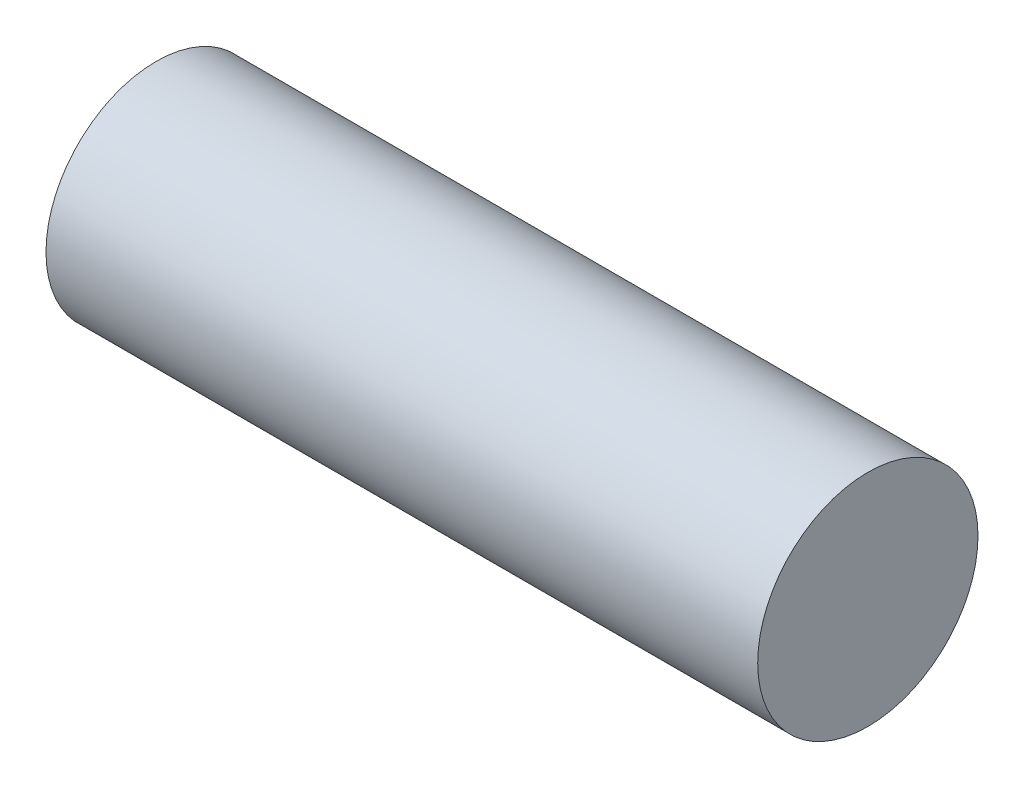
ISO-10303-21;
HEADER;
FILE_DESCRIPTION(('STEP AP214'),'2;1');
FILE_NAME('part.step','',(''),(''),'','','');
FILE_SCHEMA(('AUTOMOTIVE_DESIGN { 1 0 10303 214 1 1 1 1 }'));
ENDSEC;
DATA;
#1=APPLICATION_CONTEXT('core data for automotive mechanical design processes');
#2=APPLICATION_PROTOCOL_DEFINITION('international standard','automotive_design',2000,#1);
#3=PRODUCT_CONTEXT('',#1,'mechanical');
#4=PRODUCT('Part','Part','',(#3));
#5=PRODUCT_RELATED_PRODUCT_CATEGORY('part','',(#4));
#6=PRODUCT_DEFINITION_FORMATION('','',#4);
#7=PRODUCT_DEFINITION_CONTEXT('part definition',#1,'design');
#8=PRODUCT_DEFINITION('design','',#6,#7);
#9=PRODUCT_DEFINITION_SHAPE('','',#8);
#10=(LENGTH_UNIT() NAMED_UNIT(*) SI_UNIT(.MILLI.,.METRE.));
#11=(NAMED_UNIT(*) PLANE_ANGLE_UNIT() SI_UNIT($,.RADIAN.));
#12=(NAMED_UNIT(*) SI_UNIT($,.STERADIAN.) SOLID_ANGLE_UNIT());
#13=UNCERTAINTY_MEASURE_WITH_UNIT(LENGTH_MEASURE(1.E-05),#10,'distance_accuracy_value','');
#14=(GEOMETRIC_REPRESENTATION_CONTEXT(3) GLOBAL_UNCERTAINTY_ASSIGNED_CONTEXT((#13)) GLOBAL_UNIT_ASSIGNED_CONTEXT((#10,
#11,#12)) REPRESENTATION_CONTEXT('',''));
#15=CARTESIAN_POINT('',(0.,0.,0.));
#16=DIRECTION('',(0.,0.,1.));
#17=DIRECTION('',(1.,0.,0.));
#18=AXIS2_PLACEMENT_3D('',#15,#16,#17);
#19=CARTESIAN_POINT('',(-42.,0.,0.));
#20=DIRECTION('',(1.,0.,0.));
#21=DIRECTION('',(0.,0.,-1.));
#22=AXIS2_PLACEMENT_3D('',#19,#20,#21);
#23=CYLINDRICAL_SURFACE('',#22,6.5);
#24=CARTESIAN_POINT('',(-42.,0.,0.));
#25=DIRECTION('',(1.,0.,0.));
#26=DIRECTION('',(0.,0.,-1.));
#27=AXIS2_PLACEMENT_3D('',#24,#25,#26);
#28=CIRCLE('',#27,6.5);
#29=CARTESIAN_POINT('',(-42.,0.,-6.5));
#30=VERTEX_POINT('',#29);
#31=EDGE_CURVE('E10',#30,#30,#28,.T.);
#32=CARTESIAN_POINT('',(0.,0.,0.));
#33=DIRECTION('',(1.,0.,0.));
#34=DIRECTION('',(0.,0.,-1.));
#35=AXIS2_PLACEMENT_3D('',#32,#33,#34);
#36=CIRCLE('',#35,6.5);
#37=CARTESIAN_POINT('',(0.,0.,-6.5));
#38=VERTEX_POINT('',#37);
#39=EDGE_CURVE('E40',#38,#38,#36,.T.);
#40=CARTESIAN_POINT('',(-42.,0.,-6.5));
#41=CARTESIAN_POINT('',(-41.5625,0.,-6.5));
#42=CARTESIAN_POINT('',(-41.125,0.,-6.5));
#43=CARTESIAN_POINT('',(-40.25,0.,-6.5));
#44=CARTESIAN_POINT('',(-39.8125,0.,-6.5));
#45=CARTESIAN_POINT('',(-38.9375,0.,-6.5));
#46=CARTESIAN_POINT('',(-38.5,0.,-6.5));
#47=CARTESIAN_POINT('',(-37.625,0.,-6.5));
#48=CARTESIAN_POINT('',(-37.1875,0.,-6.5));
#49=CARTESIAN_POINT('',(-36.3125,0.,-6.5));
#50=CARTESIAN_POINT('',(-35.875,0.,-6.5));
#51=CARTESIAN_POINT('',(-35.,0.,-6.5));
#52=CARTESIAN_POINT('',(-34.5625,0.,-6.5));
#53=CARTESIAN_POINT('',(-33.6875,0.,-6.5));
#54=CARTESIAN_POINT('',(-33.25,0.,-6.5));
#55=CARTESIAN_POINT('',(-32.375,0.,-6.5));
#56=CARTESIAN_POINT('',(-31.9375,0.,-6.5));
#57=CARTESIAN_POINT('',(-31.0625,0.,-6.5));
#58=CARTESIAN_POINT('',(-30.625,0.,-6.5));
#59=CARTESIAN_POINT('',(-29.75,0.,-6.5));
#60=CARTESIAN_POINT('',(-29.3125,0.,-6.5));
#61=CARTESIAN_POINT('',(-28.4375,0.,-6.5));
#62=CARTESIAN_POINT('',(-28.,0.,-6.5));
#63=CARTESIAN_POINT('',(-27.125,0.,-6.5));
#64=CARTESIAN_POINT('',(-26.6875,0.,-6.5));
#65=CARTESIAN_POINT('',(-25.8125,0.,-6.5));
#66=CARTESIAN_POINT('',(-25.375,0.,-6.5));
#67=CARTESIAN_POINT('',(-24.5,0.,-6.5));
#68=CARTESIAN_POINT('',(-24.0625,0.,-6.5));
#69=CARTESIAN_POINT('',(-23.1875,0.,-6.5));
#70=CARTESIAN_POINT('',(-22.75,0.,-6.5));
#71=CARTESIAN_POINT('',(-21.875,0.,-6.5));
#72=CARTESIAN_POINT('',(-21.4375,0.,-6.5));
#73=CARTESIAN_POINT('',(-20.5625,0.,-6.5));
#74=CARTESIAN_POINT('',(-20.125,0.,-6.5));
#75=CARTESIAN_POINT('',(-19.25,0.,-6.5));
#76=CARTESIAN_POINT('',(-18.8125,0.,-6.5));
#77=CARTESIAN_POINT('',(-17.9375,0.,-6.5));
#78=CARTESIAN_POINT('',(-17.5,0.,-6.5));
#79=CARTESIAN_POINT('',(-16.625,0.,-6.5));
#80=CARTESIAN_POINT('',(-16.1875,0.,-6.5));
#81=CARTESIAN_POINT('',(-15.3125,0.,-6.5));
#82=CARTESIAN_POINT('',(-14.875,0.,-6.5));
#83=CARTESIAN_POINT('',(-14.,0.,-6.5));
#84=CARTESIAN_POINT('',(-13.5625,0.,-6.5));
#85=CARTESIAN_POINT('',(-12.6875,0.,-6.5));
#86=CARTESIAN_POINT('',(-12.25,0.,-6.5));
#87=CARTESIAN_POINT('',(-11.375,0.,-6.5));
#88=CARTESIAN_POINT('',(-10.9375,0.,-6.5));
#89=CARTESIAN_POINT('',(-10.0625,0.,-6.5));
#90=CARTESIAN_POINT('',(-9.625,0.,-6.5));
#91=CARTESIAN_POINT('',(-8.75,0.,-6.5));
#92=CARTESIAN_POINT('',(-8.3125,0.,-6.5));
#93=CARTESIAN_POINT('',(-7.4375,0.,-6.5));
#94=CARTESIAN_POINT('',(-7.,0.,-6.5));
#95=CARTESIAN_POINT('',(-6.12500000000001,0.,-6.5));
#96=CARTESIAN_POINT('',(-5.68750000000001,0.,-6.5));
#97=CARTESIAN_POINT('',(-4.8125,0.,-6.5));
#98=CARTESIAN_POINT('',(-4.375,0.,-6.5));
#99=CARTESIAN_POINT('',(-3.5,0.,-6.5));
#100=CARTESIAN_POINT('',(-3.0625,0.,-6.5));
#101=CARTESIAN_POINT('',(-2.1875,0.,-6.5));
#102=CARTESIAN_POINT('',(-1.75,0.,-6.5));
#103=CARTESIAN_POINT('',(-0.875000000000001,0.,-6.5));
#104=CARTESIAN_POINT('',(-0.4375,0.,-6.5));
#105=CARTESIAN_POINT('',(0.,0.,-6.5));
#106=B_SPLINE_CURVE_WITH_KNOTS('',3,(#40,#41,#42,#43,#44,#45,#46,#47,#48,#49,#50,#51,#52,#53,
#54,#55,#56,#57,#58,#59,#60,#61,#62,#63,#64,#65,#66,#67,#68,#69,#70,#71,#72,#73,#74,#75,#76,#77,
#78,#79,#80,#81,#82,#83,#84,#85,#86,#87,#88,#89,#90,#91,#92,#93,#94,#95,#96,#97,#98,#99,#100,
#101,#102,#103,#104,#105),.UNSPECIFIED.,.F.,.F.,(4,2,2,2,2,2,2,2,2,2,2,2,2,2,2,2,2,2,2,2,2,2,2,
2,2,2,2,2,2,2,2,2,4),(0.,1.3125,2.625,3.9375,5.25,6.56250000000001,7.87500000000001,9.1875,10.5,
11.8125,13.125,14.4375,15.75,17.0625,18.375,19.6875,21.,22.3125,23.625,24.9375,26.25,27.5625,
28.875,30.1875,31.5,32.8125,34.125,35.4375,36.75,38.0625,39.375,40.6875,42.),.UNSPECIFIED.);
#107=EDGE_CURVE('BSEAM37',#30,#38,#106,.T.);
#108=ORIENTED_EDGE('',*,*,#31,.T.);
#109=ORIENTED_EDGE('',*,*,#39,.F.);
#110=ORIENTED_EDGE('',*,*,#107,.T.);
#111=ORIENTED_EDGE('',*,*,#107,.F.);
#112=EDGE_LOOP('',(#108,#110,#109,#111));
#113=FACE_BOUND('',#112,.T.);
#114=ADVANCED_FACE('F37',(#113),#23,.T.);
#115=CARTESIAN_POINT('',(-42.,0.,0.));
#116=DIRECTION('',(1.,0.,0.));
#117=DIRECTION('',(0.,0.,-1.));
#118=AXIS2_PLACEMENT_3D('',#115,#116,#117);
#119=PLANE('',#118);
#120=ORIENTED_EDGE('',*,*,#31,.F.);
#121=EDGE_LOOP('',(#120));
#122=FACE_BOUND('',#121,.T.);
#123=ADVANCED_FACE('F52',(#122),#119,.F.);
#124=CARTESIAN_POINT('',(0.,0.,0.));
#125=DIRECTION('',(1.,0.,0.));
#126=DIRECTION('',(0.,0.,-1.));
#127=AXIS2_PLACEMENT_3D('',#124,#125,#126);
#128=PLANE('',#127);
#129=ORIENTED_EDGE('',*,*,#39,.T.);
#130=EDGE_LOOP('',(#129));
#131=FACE_BOUND('',#130,.T.);
#132=ADVANCED_FACE('F49',(#131),#128,.T.);
#133=CLOSED_SHELL('',(#114,#123,#132));
#134=MANIFOLD_SOLID_BREP('B2',#133);
#135=ADVANCED_BREP_SHAPE_REPRESENTATION('',(#18,#134),#14);
#136=SHAPE_DEFINITION_REPRESENTATION(#9,#135);
ENDSEC;
END-ISO-10303-21;
